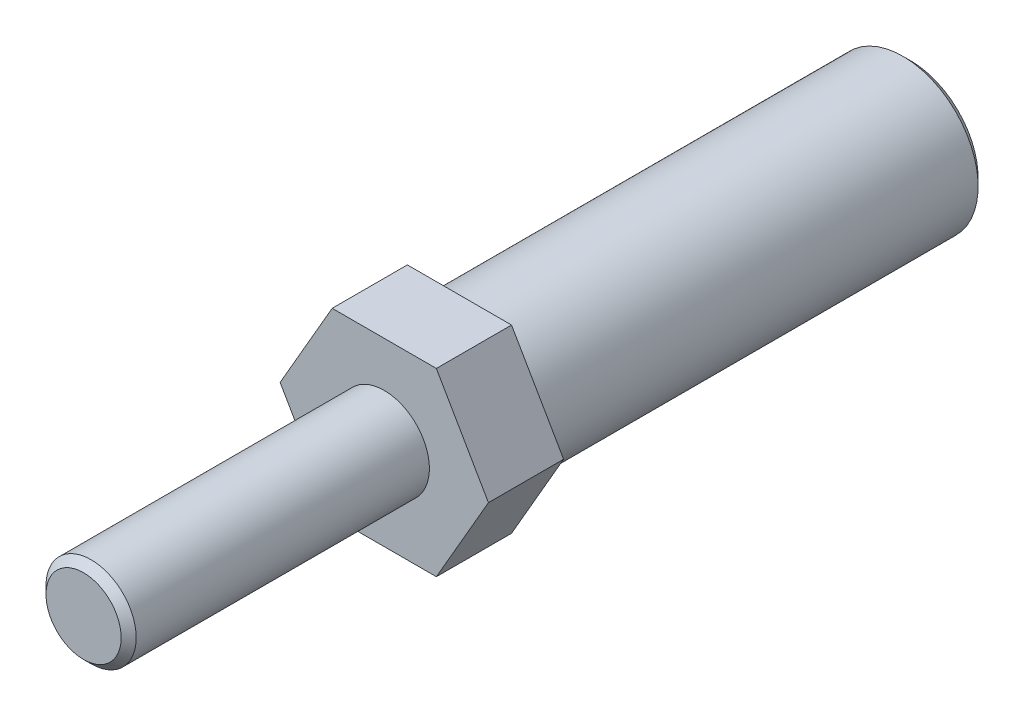
ISO-10303-21;
HEADER;
FILE_DESCRIPTION(('STEP AP214'),'2;1');
FILE_NAME('part.step','',(''),(''),'','','');
FILE_SCHEMA(('AUTOMOTIVE_DESIGN { 1 0 10303 214 1 1 1 1 }'));
ENDSEC;
DATA;
#1=APPLICATION_CONTEXT('core data for automotive mechanical design processes');
#2=APPLICATION_PROTOCOL_DEFINITION('international standard','automotive_design',2000,#1);
#3=PRODUCT_CONTEXT('',#1,'mechanical');
#4=PRODUCT('Part','Part','',(#3));
#5=PRODUCT_RELATED_PRODUCT_CATEGORY('part','',(#4));
#6=PRODUCT_DEFINITION_FORMATION('','',#4);
#7=PRODUCT_DEFINITION_CONTEXT('part definition',#1,'design');
#8=PRODUCT_DEFINITION('design','',#6,#7);
#9=PRODUCT_DEFINITION_SHAPE('','',#8);
#10=(LENGTH_UNIT() NAMED_UNIT(*) SI_UNIT(.MILLI.,.METRE.));
#11=(NAMED_UNIT(*) PLANE_ANGLE_UNIT() SI_UNIT($,.RADIAN.));
#12=(NAMED_UNIT(*) SI_UNIT($,.STERADIAN.) SOLID_ANGLE_UNIT());
#13=UNCERTAINTY_MEASURE_WITH_UNIT(LENGTH_MEASURE(1.E-05),#10,'distance_accuracy_value','');
#14=(GEOMETRIC_REPRESENTATION_CONTEXT(3) GLOBAL_UNCERTAINTY_ASSIGNED_CONTEXT((#13)) GLOBAL_UNIT_ASSIGNED_CONTEXT((#10,
#11,#12)) REPRESENTATION_CONTEXT('',''));
#15=CARTESIAN_POINT('',(0.,0.,0.));
#16=DIRECTION('',(0.,0.,1.));
#17=DIRECTION('',(1.,0.,0.));
#18=AXIS2_PLACEMENT_3D('',#15,#16,#17);
#19=CARTESIAN_POINT('',(3.46410161513775,-6.00000000000001,-2.5));
#20=DIRECTION('',(0.,0.,-1.));
#21=DIRECTION('',(-1.,0.,0.));
#22=AXIS2_PLACEMENT_3D('',#19,#20,#21);
#23=PLANE('',#22);
#24=DIRECTION('',(0.499999999999999,0.866025403784439,0.));
#25=VECTOR('',#24,1.);
#26=CARTESIAN_POINT('',(3.46410161513775,-6.00000000000001,-2.5));
#27=LINE('',#26,#25);
#28=CARTESIAN_POINT('',(3.46410161513775,-6.00000000000001,-2.5));
#29=VERTEX_POINT('',#28);
#30=CARTESIAN_POINT('',(6.92820323027551,0.,-2.5));
#31=VERTEX_POINT('',#30);
#32=EDGE_CURVE('E119',#29,#31,#27,.T.);
#33=ORIENTED_EDGE('',*,*,#32,.F.);
#34=DIRECTION('',(1.,0.,0.));
#35=VECTOR('',#34,1.);
#36=CARTESIAN_POINT('',(-3.46410161513776,-6.00000000000001,-2.5));
#37=LINE('',#36,#35);
#38=CARTESIAN_POINT('',(-3.46410161513776,-6.00000000000001,-2.5));
#39=VERTEX_POINT('',#38);
#40=EDGE_CURVE('E78',#39,#29,#37,.T.);
#41=ORIENTED_EDGE('',*,*,#40,.F.);
#42=DIRECTION('',(0.500000000000001,-0.866025403784438,0.));
#43=VECTOR('',#42,1.);
#44=CARTESIAN_POINT('',(-6.92820323027552,0.,-2.5));
#45=LINE('',#44,#43);
#46=CARTESIAN_POINT('',(-6.92820323027552,0.,-2.5));
#47=VERTEX_POINT('',#46);
#48=EDGE_CURVE('E72',#47,#39,#45,.T.);
#49=ORIENTED_EDGE('',*,*,#48,.F.);
#50=DIRECTION('',(-0.5,-0.866025403784439,0.));
#51=VECTOR('',#50,1.);
#52=CARTESIAN_POINT('',(-3.46410161513776,6.00000000000002,-2.5));
#53=LINE('',#52,#51);
#54=CARTESIAN_POINT('',(-3.46410161513776,6.00000000000002,-2.5));
#55=VERTEX_POINT('',#54);
#56=EDGE_CURVE('E109',#55,#47,#53,.T.);
#57=ORIENTED_EDGE('',*,*,#56,.F.);
#58=DIRECTION('',(-1.,0.,0.));
#59=VECTOR('',#58,1.);
#60=CARTESIAN_POINT('',(3.46410161513774,6.00000000000002,-2.5));
#61=LINE('',#60,#59);
#62=CARTESIAN_POINT('',(3.46410161513774,6.00000000000002,-2.5));
#63=VERTEX_POINT('',#62);
#64=EDGE_CURVE('E125',#63,#55,#61,.T.);
#65=ORIENTED_EDGE('',*,*,#64,.F.);
#66=DIRECTION('',(-0.500000000000001,0.866025403784438,0.));
#67=VECTOR('',#66,1.);
#68=CARTESIAN_POINT('',(6.92820323027551,0.,-2.5));
#69=LINE('',#68,#67);
#70=EDGE_CURVE('E122',#31,#63,#69,.T.);
#71=ORIENTED_EDGE('',*,*,#70,.F.);
#72=EDGE_LOOP('',(#33,#41,#49,#57,#65,#71));
#73=FACE_BOUND('',#72,.T.);
#74=CARTESIAN_POINT('',(0.,0.,-2.5));
#75=DIRECTION('',(0.,0.,-1.));
#76=DIRECTION('',(-1.,0.,0.));
#77=AXIS2_PLACEMENT_3D('',#74,#75,#76);
#78=CIRCLE('',#77,5.);
#79=CARTESIAN_POINT('',(-5.,0.,-2.5));
#80=VERTEX_POINT('',#79);
#81=EDGE_CURVE('E123',#80,#80,#78,.T.);
#82=ORIENTED_EDGE('',*,*,#81,.F.);
#83=EDGE_LOOP('',(#82));
#84=FACE_BOUND('',#83,.T.);
#85=ADVANCED_FACE('F32',(#73,#84),#23,.T.);
#86=CARTESIAN_POINT('',(3.46410161513775,-6.00000000000001,2.5));
#87=DIRECTION('',(0.,0.,-1.));
#88=DIRECTION('',(-1.,0.,0.));
#89=AXIS2_PLACEMENT_3D('',#86,#87,#88);
#90=PLANE('',#89);
#91=DIRECTION('',(0.499999999999999,0.866025403784439,0.));
#92=VECTOR('',#91,1.);
#93=CARTESIAN_POINT('',(3.46410161513775,-6.00000000000001,2.5));
#94=LINE('',#93,#92);
#95=CARTESIAN_POINT('',(3.46410161513775,-6.00000000000001,2.5));
#96=VERTEX_POINT('',#95);
#97=CARTESIAN_POINT('',(6.92820323027551,0.,2.5));
#98=VERTEX_POINT('',#97);
#99=EDGE_CURVE('E130',#96,#98,#94,.T.);
#100=ORIENTED_EDGE('',*,*,#99,.T.);
#101=DIRECTION('',(-0.500000000000001,0.866025403784438,0.));
#102=VECTOR('',#101,1.);
#103=CARTESIAN_POINT('',(6.92820323027551,0.,2.5));
#104=LINE('',#103,#102);
#105=CARTESIAN_POINT('',(3.46410161513774,6.00000000000002,2.5));
#106=VERTEX_POINT('',#105);
#107=EDGE_CURVE('E87',#98,#106,#104,.T.);
#108=ORIENTED_EDGE('',*,*,#107,.T.);
#109=DIRECTION('',(-1.,0.,0.));
#110=VECTOR('',#109,1.);
#111=CARTESIAN_POINT('',(3.46410161513774,6.00000000000002,2.5));
#112=LINE('',#111,#110);
#113=CARTESIAN_POINT('',(-3.46410161513776,6.00000000000002,2.5));
#114=VERTEX_POINT('',#113);
#115=EDGE_CURVE('E101',#106,#114,#112,.T.);
#116=ORIENTED_EDGE('',*,*,#115,.T.);
#117=DIRECTION('',(-0.5,-0.866025403784439,0.));
#118=VECTOR('',#117,1.);
#119=CARTESIAN_POINT('',(-3.46410161513776,6.00000000000002,2.5));
#120=LINE('',#119,#118);
#121=CARTESIAN_POINT('',(-6.92820323027552,0.,2.5));
#122=VERTEX_POINT('',#121);
#123=EDGE_CURVE('E94',#114,#122,#120,.T.);
#124=ORIENTED_EDGE('',*,*,#123,.T.);
#125=DIRECTION('',(0.500000000000001,-0.866025403784438,0.));
#126=VECTOR('',#125,1.);
#127=CARTESIAN_POINT('',(-6.92820323027552,0.,2.5));
#128=LINE('',#127,#126);
#129=CARTESIAN_POINT('',(-3.46410161513776,-6.00000000000001,2.5));
#130=VERTEX_POINT('',#129);
#131=EDGE_CURVE('E99',#122,#130,#128,.T.);
#132=ORIENTED_EDGE('',*,*,#131,.T.);
#133=DIRECTION('',(1.,0.,0.));
#134=VECTOR('',#133,1.);
#135=CARTESIAN_POINT('',(-3.46410161513776,-6.00000000000001,2.5));
#136=LINE('',#135,#134);
#137=EDGE_CURVE('E49',#130,#96,#136,.T.);
#138=ORIENTED_EDGE('',*,*,#137,.T.);
#139=EDGE_LOOP('',(#100,#108,#116,#124,#132,#138));
#140=FACE_BOUND('',#139,.T.);
#141=CARTESIAN_POINT('',(0.,0.,2.5));
#142=DIRECTION('',(0.,0.,-1.));
#143=DIRECTION('',(-1.,0.,0.));
#144=AXIS2_PLACEMENT_3D('',#141,#142,#143);
#145=CIRCLE('',#144,3.);
#146=CARTESIAN_POINT('',(-3.,0.,2.5));
#147=VERTEX_POINT('',#146);
#148=EDGE_CURVE('E139',#147,#147,#145,.F.);
#149=ORIENTED_EDGE('',*,*,#148,.F.);
#150=EDGE_LOOP('',(#149));
#151=FACE_BOUND('',#150,.T.);
#152=ADVANCED_FACE('F96',(#140,#151),#90,.F.);
#153=CARTESIAN_POINT('',(3.46410161513775,-6.00000000000001,2.5));
#154=DIRECTION('',(-0.866025403784439,0.499999999999999,0.));
#155=DIRECTION('',(-0.499999999999999,-0.866025403784439,0.));
#156=AXIS2_PLACEMENT_3D('',#153,#154,#155);
#157=PLANE('',#156);
#158=ORIENTED_EDGE('',*,*,#32,.T.);
#159=DIRECTION('',(0.,0.,-1.));
#160=VECTOR('',#159,1.);
#161=CARTESIAN_POINT('',(6.92820323027551,0.,2.5));
#162=LINE('',#161,#160);
#163=EDGE_CURVE('E137',#98,#31,#162,.T.);
#164=ORIENTED_EDGE('',*,*,#163,.F.);
#165=ORIENTED_EDGE('',*,*,#99,.F.);
#166=DIRECTION('',(0.,0.,-1.));
#167=VECTOR('',#166,1.);
#168=CARTESIAN_POINT('',(3.46410161513775,-6.00000000000001,2.5));
#169=LINE('',#168,#167);
#170=EDGE_CURVE('E115',#96,#29,#169,.T.);
#171=ORIENTED_EDGE('',*,*,#170,.T.);
#172=EDGE_LOOP('',(#158,#164,#165,#171));
#173=FACE_BOUND('',#172,.T.);
#174=ADVANCED_FACE('F166',(#173),#157,.F.);
#175=CARTESIAN_POINT('',(6.92820323027551,0.,2.5));
#176=DIRECTION('',(-0.866025403784438,-0.500000000000001,0.));
#177=DIRECTION('',(0.500000000000001,-0.866025403784438,0.));
#178=AXIS2_PLACEMENT_3D('',#175,#176,#177);
#179=PLANE('',#178);
#180=ORIENTED_EDGE('',*,*,#70,.T.);
#181=DIRECTION('',(0.,0.,-1.));
#182=VECTOR('',#181,1.);
#183=CARTESIAN_POINT('',(3.46410161513774,6.00000000000002,2.5));
#184=LINE('',#183,#182);
#185=EDGE_CURVE('E134',#106,#63,#184,.T.);
#186=ORIENTED_EDGE('',*,*,#185,.F.);
#187=ORIENTED_EDGE('',*,*,#107,.F.);
#188=ORIENTED_EDGE('',*,*,#163,.T.);
#189=EDGE_LOOP('',(#180,#186,#187,#188));
#190=FACE_BOUND('',#189,.T.);
#191=ADVANCED_FACE('F183',(#190),#179,.F.);
#192=CARTESIAN_POINT('',(3.46410161513774,6.00000000000002,2.5));
#193=DIRECTION('',(0.,-1.,0.));
#194=DIRECTION('',(0.,0.,-1.));
#195=AXIS2_PLACEMENT_3D('',#192,#193,#194);
#196=PLANE('',#195);
#197=ORIENTED_EDGE('',*,*,#64,.T.);
#198=DIRECTION('',(0.,0.,-1.));
#199=VECTOR('',#198,1.);
#200=CARTESIAN_POINT('',(-3.46410161513776,6.00000000000002,2.5));
#201=LINE('',#200,#199);
#202=EDGE_CURVE('E110',#114,#55,#201,.T.);
#203=ORIENTED_EDGE('',*,*,#202,.F.);
#204=ORIENTED_EDGE('',*,*,#115,.F.);
#205=ORIENTED_EDGE('',*,*,#185,.T.);
#206=EDGE_LOOP('',(#197,#203,#204,#205));
#207=FACE_BOUND('',#206,.T.);
#208=ADVANCED_FACE('F180',(#207),#196,.F.);
#209=CARTESIAN_POINT('',(-3.46410161513776,6.00000000000002,2.5));
#210=DIRECTION('',(0.866025403784439,-0.5,0.));
#211=DIRECTION('',(0.5,0.866025403784439,0.));
#212=AXIS2_PLACEMENT_3D('',#209,#210,#211);
#213=PLANE('',#212);
#214=ORIENTED_EDGE('',*,*,#56,.T.);
#215=DIRECTION('',(0.,0.,-1.));
#216=VECTOR('',#215,1.);
#217=CARTESIAN_POINT('',(-6.92820323027552,0.,2.5));
#218=LINE('',#217,#216);
#219=EDGE_CURVE('E106',#122,#47,#218,.T.);
#220=ORIENTED_EDGE('',*,*,#219,.F.);
#221=ORIENTED_EDGE('',*,*,#123,.F.);
#222=ORIENTED_EDGE('',*,*,#202,.T.);
#223=EDGE_LOOP('',(#214,#220,#221,#222));
#224=FACE_BOUND('',#223,.T.);
#225=ADVANCED_FACE('F107',(#224),#213,.F.);
#226=CARTESIAN_POINT('',(-6.92820323027552,0.,2.5));
#227=DIRECTION('',(0.866025403784438,0.500000000000001,0.));
#228=DIRECTION('',(-0.500000000000001,0.866025403784438,0.));
#229=AXIS2_PLACEMENT_3D('',#226,#227,#228);
#230=PLANE('',#229);
#231=ORIENTED_EDGE('',*,*,#48,.T.);
#232=DIRECTION('',(0.,0.,-1.));
#233=VECTOR('',#232,1.);
#234=CARTESIAN_POINT('',(-3.46410161513776,-6.00000000000001,2.5));
#235=LINE('',#234,#233);
#236=EDGE_CURVE('E111',#130,#39,#235,.T.);
#237=ORIENTED_EDGE('',*,*,#236,.F.);
#238=ORIENTED_EDGE('',*,*,#131,.F.);
#239=ORIENTED_EDGE('',*,*,#219,.T.);
#240=EDGE_LOOP('',(#231,#237,#238,#239));
#241=FACE_BOUND('',#240,.T.);
#242=ADVANCED_FACE('F113',(#241),#230,.F.);
#243=CARTESIAN_POINT('',(-3.46410161513776,-6.00000000000001,2.5));
#244=DIRECTION('',(0.,1.,0.));
#245=DIRECTION('',(-1.,0.,0.));
#246=AXIS2_PLACEMENT_3D('',#243,#244,#245);
#247=PLANE('',#246);
#248=ORIENTED_EDGE('',*,*,#40,.T.);
#249=ORIENTED_EDGE('',*,*,#170,.F.);
#250=ORIENTED_EDGE('',*,*,#137,.F.);
#251=ORIENTED_EDGE('',*,*,#236,.T.);
#252=EDGE_LOOP('',(#248,#249,#250,#251));
#253=FACE_BOUND('',#252,.T.);
#254=ADVANCED_FACE('F172',(#253),#247,.F.);
#255=CARTESIAN_POINT('',(0.,0.,22.5));
#256=DIRECTION('',(0.,0.,-1.));
#257=DIRECTION('',(-1.,0.,0.));
#258=AXIS2_PLACEMENT_3D('',#255,#256,#257);
#259=CYLINDRICAL_SURFACE('',#258,3.);
#260=CARTESIAN_POINT('',(0.,0.,22.));
#261=DIRECTION('',(0.,0.,1.));
#262=DIRECTION('',(1.,0.,0.));
#263=AXIS2_PLACEMENT_3D('',#260,#261,#262);
#264=CIRCLE('',#263,3.);
#265=CARTESIAN_POINT('',(3.,0.,22.));
#266=VERTEX_POINT('',#265);
#267=EDGE_CURVE('E145',#266,#266,#264,.F.);
#268=ORIENTED_EDGE('',*,*,#267,.T.);
#269=EDGE_LOOP('',(#268));
#270=FACE_BOUND('',#269,.T.);
#271=ORIENTED_EDGE('',*,*,#148,.T.);
#272=EDGE_LOOP('',(#271));
#273=FACE_BOUND('',#272,.T.);
#274=ADVANCED_FACE('F175',(#270,#273),#259,.T.);
#275=CARTESIAN_POINT('',(0.,0.,22.5));
#276=DIRECTION('',(0.,0.,1.));
#277=DIRECTION('',(1.,0.,0.));
#278=AXIS2_PLACEMENT_3D('',#275,#276,#277);
#279=PLANE('',#278);
#280=CARTESIAN_POINT('',(0.,0.,22.5));
#281=DIRECTION('',(0.,0.,1.));
#282=DIRECTION('',(1.,0.,0.));
#283=AXIS2_PLACEMENT_3D('',#280,#281,#282);
#284=CIRCLE('',#283,2.49999999999998);
#285=CARTESIAN_POINT('',(2.49999999999998,0.,22.5));
#286=VERTEX_POINT('',#285);
#287=EDGE_CURVE('E142',#286,#286,#284,.T.);
#288=ORIENTED_EDGE('',*,*,#287,.T.);
#289=EDGE_LOOP('',(#288));
#290=FACE_BOUND('',#289,.T.);
#291=ADVANCED_FACE('F202',(#290),#279,.T.);
#292=CARTESIAN_POINT('',(0.,0.,-32.5));
#293=DIRECTION('',(0.,0.,1.));
#294=DIRECTION('',(1.,0.,0.));
#295=AXIS2_PLACEMENT_3D('',#292,#293,#294);
#296=CYLINDRICAL_SURFACE('',#295,5.);
#297=CARTESIAN_POINT('',(0.,0.,-32.));
#298=DIRECTION('',(0.,0.,-1.));
#299=DIRECTION('',(-1.,0.,0.));
#300=AXIS2_PLACEMENT_3D('',#297,#298,#299);
#301=CIRCLE('',#300,5.);
#302=CARTESIAN_POINT('',(-5.,0.,-32.));
#303=VERTEX_POINT('',#302);
#304=EDGE_CURVE('E11',#303,#303,#301,.F.);
#305=ORIENTED_EDGE('',*,*,#304,.T.);
#306=EDGE_LOOP('',(#305));
#307=FACE_BOUND('',#306,.T.);
#308=ORIENTED_EDGE('',*,*,#81,.T.);
#309=EDGE_LOOP('',(#308));
#310=FACE_BOUND('',#309,.T.);
#311=ADVANCED_FACE('F200',(#307,#310),#296,.T.);
#312=CARTESIAN_POINT('',(0.,0.,-32.5));
#313=DIRECTION('',(0.,0.,-1.));
#314=DIRECTION('',(-1.,0.,0.));
#315=AXIS2_PLACEMENT_3D('',#312,#313,#314);
#316=PLANE('',#315);
#317=CARTESIAN_POINT('',(0.,0.,-32.5));
#318=DIRECTION('',(0.,0.,-1.));
#319=DIRECTION('',(-1.,0.,0.));
#320=AXIS2_PLACEMENT_3D('',#317,#318,#319);
#321=CIRCLE('',#320,4.5);
#322=CARTESIAN_POINT('',(-4.5,0.,-32.5));
#323=VERTEX_POINT('',#322);
#324=EDGE_CURVE('E41',#323,#323,#321,.T.);
#325=ORIENTED_EDGE('',*,*,#324,.T.);
#326=EDGE_LOOP('',(#325));
#327=FACE_BOUND('',#326,.T.);
#328=ADVANCED_FACE('F150',(#327),#316,.T.);
#329=CARTESIAN_POINT('',(0.,0.,22.5));
#330=DIRECTION('',(0.,0.,-1.));
#331=DIRECTION('',(-1.,0.,0.));
#332=AXIS2_PLACEMENT_3D('',#329,#330,#331);
#333=CONICAL_SURFACE('',#332,2.49999999999998,0.785398163397453);
#334=ORIENTED_EDGE('',*,*,#267,.F.);
#335=EDGE_LOOP('',(#334));
#336=FACE_BOUND('',#335,.T.);
#337=ORIENTED_EDGE('',*,*,#287,.F.);
#338=EDGE_LOOP('',(#337));
#339=FACE_BOUND('',#338,.T.);
#340=ADVANCED_FACE('F153',(#336,#339),#333,.T.);
#341=CARTESIAN_POINT('',(0.,0.,-32.5));
#342=DIRECTION('',(0.,0.,1.));
#343=DIRECTION('',(1.,0.,0.));
#344=AXIS2_PLACEMENT_3D('',#341,#342,#343);
#345=CONICAL_SURFACE('',#344,4.5,0.785398163397437);
#346=ORIENTED_EDGE('',*,*,#304,.F.);
#347=EDGE_LOOP('',(#346));
#348=FACE_BOUND('',#347,.T.);
#349=ORIENTED_EDGE('',*,*,#324,.F.);
#350=EDGE_LOOP('',(#349));
#351=FACE_BOUND('',#350,.T.);
#352=ADVANCED_FACE('F34',(#348,#351),#345,.T.);
#353=CLOSED_SHELL('',(#85,#152,#174,#191,#208,#225,#242,#254,#274,#291,#311,#328,#340,#352));
#354=MANIFOLD_SOLID_BREP('B2',#353);
#355=ADVANCED_BREP_SHAPE_REPRESENTATION('',(#18,#354),#14);
#356=SHAPE_DEFINITION_REPRESENTATION(#9,#355);
ENDSEC;
END-ISO-10303-21;
